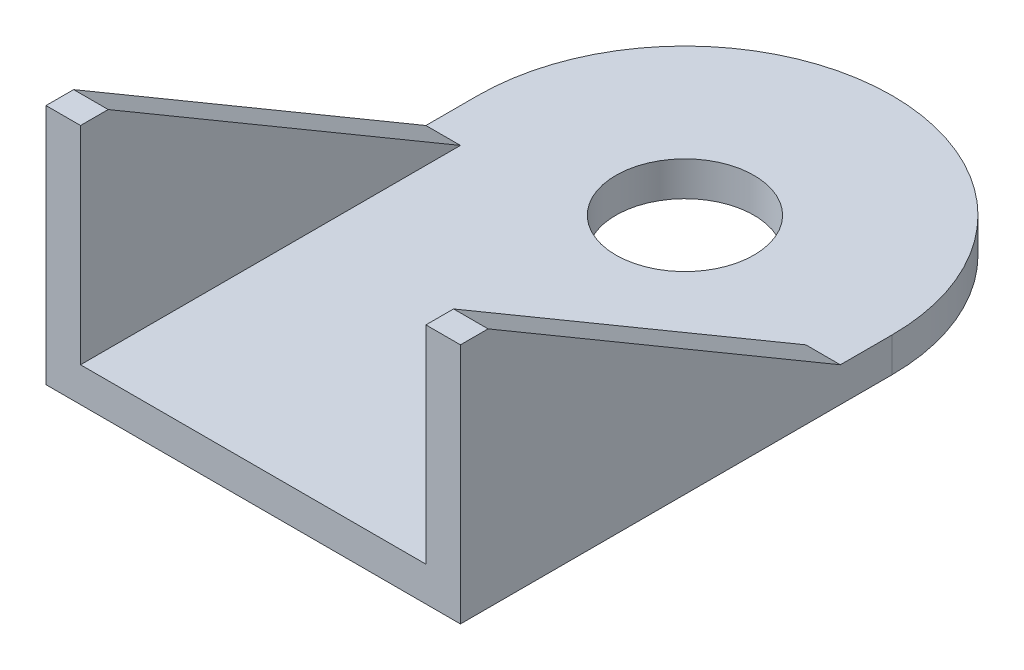
ISO-10303-21;
HEADER;
FILE_DESCRIPTION(('STEP AP214'),'2;1');
FILE_NAME('part.step','',(''),(''),'','','');
FILE_SCHEMA(('AUTOMOTIVE_DESIGN { 1 0 10303 214 1 1 1 1 }'));
ENDSEC;
DATA;
#1=APPLICATION_CONTEXT('core data for automotive mechanical design processes');
#2=APPLICATION_PROTOCOL_DEFINITION('international standard','automotive_design',2000,#1);
#3=PRODUCT_CONTEXT('',#1,'mechanical');
#4=PRODUCT('Part','Part','',(#3));
#5=PRODUCT_RELATED_PRODUCT_CATEGORY('part','',(#4));
#6=PRODUCT_DEFINITION_FORMATION('','',#4);
#7=PRODUCT_DEFINITION_CONTEXT('part definition',#1,'design');
#8=PRODUCT_DEFINITION('design','',#6,#7);
#9=PRODUCT_DEFINITION_SHAPE('','',#8);
#10=(LENGTH_UNIT() NAMED_UNIT(*) SI_UNIT(.MILLI.,.METRE.));
#11=(NAMED_UNIT(*) PLANE_ANGLE_UNIT() SI_UNIT($,.RADIAN.));
#12=(NAMED_UNIT(*) SI_UNIT($,.STERADIAN.) SOLID_ANGLE_UNIT());
#13=UNCERTAINTY_MEASURE_WITH_UNIT(LENGTH_MEASURE(1.E-05),#10,'distance_accuracy_value','');
#14=(GEOMETRIC_REPRESENTATION_CONTEXT(3) GLOBAL_UNCERTAINTY_ASSIGNED_CONTEXT((#13)) GLOBAL_UNIT_ASSIGNED_CONTEXT((#10,
#11,#12)) REPRESENTATION_CONTEXT('',''));
#15=CARTESIAN_POINT('',(0.,0.,0.));
#16=DIRECTION('',(0.,0.,1.));
#17=DIRECTION('',(1.,0.,0.));
#18=AXIS2_PLACEMENT_3D('',#15,#16,#17);
#19=CARTESIAN_POINT('',(0.,0.,0.));
#20=DIRECTION('',(0.,1.,0.));
#21=DIRECTION('',(0.,0.,1.));
#22=AXIS2_PLACEMENT_3D('',#19,#20,#21);
#23=PLANE('',#22);
#24=CARTESIAN_POINT('',(0.,0.,0.));
#25=DIRECTION('',(0.,1.,0.));
#26=DIRECTION('',(0.,0.,1.));
#27=AXIS2_PLACEMENT_3D('',#24,#25,#26);
#28=CIRCLE('',#27,12.);
#29=CARTESIAN_POINT('',(12.,0.,0.));
#30=VERTEX_POINT('',#29);
#31=CARTESIAN_POINT('',(-12.,0.,0.));
#32=VERTEX_POINT('',#31);
#33=EDGE_CURVE('E11',#30,#32,#28,.F.);
#34=ORIENTED_EDGE('',*,*,#33,.F.);
#35=DIRECTION('',(0.,0.,-1.));
#36=VECTOR('',#35,1.);
#37=CARTESIAN_POINT('',(12.,0.,0.));
#38=LINE('',#37,#36);
#39=CARTESIAN_POINT('',(12.,0.,25.));
#40=VERTEX_POINT('',#39);
#41=EDGE_CURVE('E173',#40,#30,#38,.T.);
#42=ORIENTED_EDGE('',*,*,#41,.F.);
#43=DIRECTION('',(1.,0.,0.));
#44=VECTOR('',#43,1.);
#45=CARTESIAN_POINT('',(0.,0.,25.));
#46=LINE('',#45,#44);
#47=CARTESIAN_POINT('',(-12.,0.,25.));
#48=VERTEX_POINT('',#47);
#49=EDGE_CURVE('E194',#48,#40,#46,.T.);
#50=ORIENTED_EDGE('',*,*,#49,.F.);
#51=DIRECTION('',(0.,0.,1.));
#52=VECTOR('',#51,1.);
#53=CARTESIAN_POINT('',(-12.,0.,0.));
#54=LINE('',#53,#52);
#55=EDGE_CURVE('E192',#32,#48,#54,.T.);
#56=ORIENTED_EDGE('',*,*,#55,.F.);
#57=EDGE_LOOP('',(#34,#42,#50,#56));
#58=FACE_BOUND('',#57,.T.);
#59=ADVANCED_FACE('F41',(#58),#23,.F.);
#60=CARTESIAN_POINT('',(0.,0.,0.));
#61=DIRECTION('',(0.,1.,0.));
#62=DIRECTION('',(0.,0.,1.));
#63=AXIS2_PLACEMENT_3D('',#60,#61,#62);
#64=CIRCLE('',#63,12.);
#65=EDGE_CURVE('E189',#30,#32,#64,.T.);
#66=ORIENTED_EDGE('',*,*,#65,.F.);
#67=ORIENTED_EDGE('',*,*,#33,.T.);
#68=EDGE_LOOP('',(#66,#67));
#69=FACE_BOUND('',#68,.T.);
#70=CARTESIAN_POINT('',(0.,0.,0.));
#71=DIRECTION('',(0.,1.,0.));
#72=DIRECTION('',(0.,0.,1.));
#73=AXIS2_PLACEMENT_3D('',#70,#71,#72);
#74=CIRCLE('',#73,9.);
#75=CARTESIAN_POINT('',(0.,0.,9.));
#76=VERTEX_POINT('',#75);
#77=EDGE_CURVE('E50',#76,#76,#74,.F.);
#78=ORIENTED_EDGE('',*,*,#77,.F.);
#79=EDGE_LOOP('',(#78));
#80=FACE_BOUND('',#79,.T.);
#81=ADVANCED_FACE('F217',(#69,#80),#23,.F.);
#82=CARTESIAN_POINT('',(0.,2.,0.));
#83=DIRECTION('',(0.,1.,0.));
#84=DIRECTION('',(0.,0.,1.));
#85=AXIS2_PLACEMENT_3D('',#82,#83,#84);
#86=PLANE('',#85);
#87=CARTESIAN_POINT('',(0.,2.,0.));
#88=DIRECTION('',(0.,1.,0.));
#89=DIRECTION('',(0.,0.,1.));
#90=AXIS2_PLACEMENT_3D('',#87,#88,#89);
#91=CIRCLE('',#90,4.);
#92=CARTESIAN_POINT('',(0.,2.,4.));
#93=VERTEX_POINT('',#92);
#94=EDGE_CURVE('E127',#93,#93,#91,.T.);
#95=ORIENTED_EDGE('',*,*,#94,.F.);
#96=EDGE_LOOP('',(#95));
#97=FACE_BOUND('',#96,.T.);
#98=DIRECTION('',(0.,0.,1.));
#99=VECTOR('',#98,1.);
#100=CARTESIAN_POINT('',(-12.,2.,0.));
#101=LINE('',#100,#99);
#102=CARTESIAN_POINT('',(-12.,2.,0.));
#103=VERTEX_POINT('',#102);
#104=CARTESIAN_POINT('',(-12.,2.,3.));
#105=VERTEX_POINT('',#104);
#106=EDGE_CURVE('E62',#103,#105,#101,.T.);
#107=ORIENTED_EDGE('',*,*,#106,.T.);
#108=DIRECTION('',(-1.,0.,0.));
#109=VECTOR('',#108,1.);
#110=CARTESIAN_POINT('',(-10.,2.,3.));
#111=LINE('',#110,#109);
#112=CARTESIAN_POINT('',(-10.,2.,3.));
#113=VERTEX_POINT('',#112);
#114=EDGE_CURVE('E57',#113,#105,#111,.T.);
#115=ORIENTED_EDGE('',*,*,#114,.F.);
#116=DIRECTION('',(0.,0.,-1.));
#117=VECTOR('',#116,1.);
#118=CARTESIAN_POINT('',(-10.,2.,3.));
#119=LINE('',#118,#117);
#120=CARTESIAN_POINT('',(-10.,2.,25.));
#121=VERTEX_POINT('',#120);
#122=EDGE_CURVE('E130',#121,#113,#119,.T.);
#123=ORIENTED_EDGE('',*,*,#122,.F.);
#124=DIRECTION('',(1.,0.,0.));
#125=VECTOR('',#124,1.);
#126=CARTESIAN_POINT('',(0.,2.,25.));
#127=LINE('',#126,#125);
#128=CARTESIAN_POINT('',(10.,2.,25.));
#129=VERTEX_POINT('',#128);
#130=EDGE_CURVE('E118',#121,#129,#127,.T.);
#131=ORIENTED_EDGE('',*,*,#130,.T.);
#132=DIRECTION('',(0.,0.,-1.));
#133=VECTOR('',#132,1.);
#134=CARTESIAN_POINT('',(10.,2.,3.));
#135=LINE('',#134,#133);
#136=CARTESIAN_POINT('',(10.,2.,3.));
#137=VERTEX_POINT('',#136);
#138=EDGE_CURVE('E155',#129,#137,#135,.T.);
#139=ORIENTED_EDGE('',*,*,#138,.T.);
#140=DIRECTION('',(1.,0.,0.));
#141=VECTOR('',#140,1.);
#142=CARTESIAN_POINT('',(10.,2.,3.));
#143=LINE('',#142,#141);
#144=CARTESIAN_POINT('',(12.,2.,3.));
#145=VERTEX_POINT('',#144);
#146=EDGE_CURVE('E165',#137,#145,#143,.T.);
#147=ORIENTED_EDGE('',*,*,#146,.T.);
#148=DIRECTION('',(0.,0.,-1.));
#149=VECTOR('',#148,1.);
#150=CARTESIAN_POINT('',(12.,2.,0.));
#151=LINE('',#150,#149);
#152=CARTESIAN_POINT('',(12.,2.,0.));
#153=VERTEX_POINT('',#152);
#154=EDGE_CURVE('E178',#145,#153,#151,.T.);
#155=ORIENTED_EDGE('',*,*,#154,.T.);
#156=CARTESIAN_POINT('',(0.,2.,0.));
#157=DIRECTION('',(0.,1.,0.));
#158=DIRECTION('',(0.,0.,1.));
#159=AXIS2_PLACEMENT_3D('',#156,#157,#158);
#160=CIRCLE('',#159,12.);
#161=EDGE_CURVE('E180',#153,#103,#160,.T.);
#162=ORIENTED_EDGE('',*,*,#161,.T.);
#163=EDGE_LOOP('',(#107,#115,#123,#131,#139,#147,#155,#162));
#164=FACE_BOUND('',#163,.T.);
#165=ADVANCED_FACE('F131',(#97,#164),#86,.T.);
#166=CARTESIAN_POINT('',(12.,2.,0.));
#167=DIRECTION('',(-1.,0.,0.));
#168=DIRECTION('',(0.,0.,1.));
#169=AXIS2_PLACEMENT_3D('',#166,#167,#168);
#170=PLANE('',#169);
#171=ORIENTED_EDGE('',*,*,#41,.T.);
#172=DIRECTION('',(0.,-1.,0.));
#173=VECTOR('',#172,1.);
#174=CARTESIAN_POINT('',(12.,2.,0.));
#175=LINE('',#174,#173);
#176=EDGE_CURVE('E206',#153,#30,#175,.T.);
#177=ORIENTED_EDGE('',*,*,#176,.F.);
#178=ORIENTED_EDGE('',*,*,#154,.F.);
#179=DIRECTION('',(0.,0.507020126563394,0.861934215157769));
#180=VECTOR('',#179,1.);
#181=CARTESIAN_POINT('',(12.,14.,23.4));
#182=LINE('',#181,#180);
#183=CARTESIAN_POINT('',(12.,14.,23.4));
#184=VERTEX_POINT('',#183);
#185=EDGE_CURVE('E150',#145,#184,#182,.T.);
#186=ORIENTED_EDGE('',*,*,#185,.T.);
#187=DIRECTION('',(0.,0.,1.));
#188=VECTOR('',#187,1.);
#189=CARTESIAN_POINT('',(12.,14.,25.));
#190=LINE('',#189,#188);
#191=CARTESIAN_POINT('',(12.,14.,25.));
#192=VERTEX_POINT('',#191);
#193=EDGE_CURVE('E158',#184,#192,#190,.T.);
#194=ORIENTED_EDGE('',*,*,#193,.T.);
#195=DIRECTION('',(0.,-1.,0.));
#196=VECTOR('',#195,1.);
#197=CARTESIAN_POINT('',(12.,2.,25.));
#198=LINE('',#197,#196);
#199=EDGE_CURVE('E186',#192,#40,#198,.T.);
#200=ORIENTED_EDGE('',*,*,#199,.T.);
#201=EDGE_LOOP('',(#171,#177,#178,#186,#194,#200));
#202=FACE_BOUND('',#201,.T.);
#203=ADVANCED_FACE('F43',(#202),#170,.F.);
#204=CARTESIAN_POINT('',(0.,2.,0.));
#205=DIRECTION('',(0.,-1.,0.));
#206=DIRECTION('',(0.,0.,-1.));
#207=AXIS2_PLACEMENT_3D('',#204,#205,#206);
#208=CYLINDRICAL_SURFACE('',#207,12.);
#209=ORIENTED_EDGE('',*,*,#65,.T.);
#210=DIRECTION('',(0.,-1.,0.));
#211=VECTOR('',#210,1.);
#212=CARTESIAN_POINT('',(-12.,2.,0.));
#213=LINE('',#212,#211);
#214=EDGE_CURVE('E203',#103,#32,#213,.T.);
#215=ORIENTED_EDGE('',*,*,#214,.F.);
#216=ORIENTED_EDGE('',*,*,#161,.F.);
#217=ORIENTED_EDGE('',*,*,#176,.T.);
#218=EDGE_LOOP('',(#209,#215,#216,#217));
#219=FACE_BOUND('',#218,.T.);
#220=ADVANCED_FACE('F249',(#219),#208,.T.);
#221=CARTESIAN_POINT('',(-12.,2.,0.));
#222=DIRECTION('',(1.,0.,0.));
#223=DIRECTION('',(0.,0.,-1.));
#224=AXIS2_PLACEMENT_3D('',#221,#222,#223);
#225=PLANE('',#224);
#226=ORIENTED_EDGE('',*,*,#55,.T.);
#227=DIRECTION('',(0.,-1.,0.));
#228=VECTOR('',#227,1.);
#229=CARTESIAN_POINT('',(-12.,2.,25.));
#230=LINE('',#229,#228);
#231=CARTESIAN_POINT('',(-12.,14.,25.));
#232=VERTEX_POINT('',#231);
#233=EDGE_CURVE('E200',#232,#48,#230,.T.);
#234=ORIENTED_EDGE('',*,*,#233,.F.);
#235=DIRECTION('',(0.,0.,1.));
#236=VECTOR('',#235,1.);
#237=CARTESIAN_POINT('',(-12.,14.,25.));
#238=LINE('',#237,#236);
#239=CARTESIAN_POINT('',(-12.,14.,23.4));
#240=VERTEX_POINT('',#239);
#241=EDGE_CURVE('E145',#240,#232,#238,.T.);
#242=ORIENTED_EDGE('',*,*,#241,.F.);
#243=DIRECTION('',(0.,0.507020126563394,0.861934215157769));
#244=VECTOR('',#243,1.);
#245=CARTESIAN_POINT('',(-12.,14.,23.4));
#246=LINE('',#245,#244);
#247=EDGE_CURVE('E133',#105,#240,#246,.T.);
#248=ORIENTED_EDGE('',*,*,#247,.F.);
#249=ORIENTED_EDGE('',*,*,#106,.F.);
#250=ORIENTED_EDGE('',*,*,#214,.T.);
#251=EDGE_LOOP('',(#226,#234,#242,#248,#249,#250));
#252=FACE_BOUND('',#251,.T.);
#253=ADVANCED_FACE('F244',(#252),#225,.F.);
#254=CARTESIAN_POINT('',(0.,2.,25.));
#255=DIRECTION('',(0.,0.,-1.));
#256=DIRECTION('',(-1.,0.,0.));
#257=AXIS2_PLACEMENT_3D('',#254,#255,#256);
#258=PLANE('',#257);
#259=ORIENTED_EDGE('',*,*,#49,.T.);
#260=ORIENTED_EDGE('',*,*,#199,.F.);
#261=DIRECTION('',(1.,0.,0.));
#262=VECTOR('',#261,1.);
#263=CARTESIAN_POINT('',(10.,14.,25.));
#264=LINE('',#263,#262);
#265=CARTESIAN_POINT('',(10.,14.,25.));
#266=VERTEX_POINT('',#265);
#267=EDGE_CURVE('E170',#266,#192,#264,.T.);
#268=ORIENTED_EDGE('',*,*,#267,.F.);
#269=DIRECTION('',(0.,-1.,0.));
#270=VECTOR('',#269,1.);
#271=CARTESIAN_POINT('',(10.,2.,25.));
#272=LINE('',#271,#270);
#273=EDGE_CURVE('E124',#266,#129,#272,.T.);
#274=ORIENTED_EDGE('',*,*,#273,.T.);
#275=ORIENTED_EDGE('',*,*,#130,.F.);
#276=DIRECTION('',(0.,-1.,0.));
#277=VECTOR('',#276,1.);
#278=CARTESIAN_POINT('',(-10.,2.,25.));
#279=LINE('',#278,#277);
#280=CARTESIAN_POINT('',(-10.,14.,25.));
#281=VERTEX_POINT('',#280);
#282=EDGE_CURVE('E122',#281,#121,#279,.T.);
#283=ORIENTED_EDGE('',*,*,#282,.F.);
#284=DIRECTION('',(-1.,0.,0.));
#285=VECTOR('',#284,1.);
#286=CARTESIAN_POINT('',(-10.,14.,25.));
#287=LINE('',#286,#285);
#288=EDGE_CURVE('E144',#281,#232,#287,.T.);
#289=ORIENTED_EDGE('',*,*,#288,.T.);
#290=ORIENTED_EDGE('',*,*,#233,.T.);
#291=EDGE_LOOP('',(#259,#260,#268,#274,#275,#283,#289,#290));
#292=FACE_BOUND('',#291,.T.);
#293=ADVANCED_FACE('F119',(#292),#258,.F.);
#294=CARTESIAN_POINT('',(0.,2.,0.));
#295=DIRECTION('',(0.,-1.,0.));
#296=DIRECTION('',(0.,0.,-1.));
#297=AXIS2_PLACEMENT_3D('',#294,#295,#296);
#298=CYLINDRICAL_SURFACE('',#297,4.);
#299=ORIENTED_EDGE('',*,*,#94,.T.);
#300=EDGE_LOOP('',(#299));
#301=FACE_BOUND('',#300,.T.);
#302=CARTESIAN_POINT('',(0.,0.,0.));
#303=DIRECTION('',(0.,1.,0.));
#304=DIRECTION('',(0.,0.,1.));
#305=AXIS2_PLACEMENT_3D('',#302,#303,#304);
#306=CIRCLE('',#305,4.);
#307=CARTESIAN_POINT('',(0.,0.,4.));
#308=VERTEX_POINT('',#307);
#309=EDGE_CURVE('E181',#308,#308,#306,.T.);
#310=ORIENTED_EDGE('',*,*,#309,.F.);
#311=EDGE_LOOP('',(#310));
#312=FACE_BOUND('',#311,.T.);
#313=ADVANCED_FACE('F232',(#301,#312),#298,.F.);
#314=ORIENTED_EDGE('',*,*,#77,.T.);
#315=EDGE_LOOP('',(#314));
#316=FACE_BOUND('',#315,.T.);
#317=ORIENTED_EDGE('',*,*,#309,.T.);
#318=EDGE_LOOP('',(#317));
#319=FACE_BOUND('',#318,.T.);
#320=ADVANCED_FACE('F214',(#316,#319),#23,.F.);
#321=CARTESIAN_POINT('',(10.,14.,25.));
#322=DIRECTION('',(0.,1.,0.));
#323=DIRECTION('',(0.,0.,1.));
#324=AXIS2_PLACEMENT_3D('',#321,#322,#323);
#325=PLANE('',#324);
#326=ORIENTED_EDGE('',*,*,#193,.F.);
#327=DIRECTION('',(1.,0.,0.));
#328=VECTOR('',#327,1.);
#329=CARTESIAN_POINT('',(10.,14.,23.4));
#330=LINE('',#329,#328);
#331=CARTESIAN_POINT('',(10.,14.,23.4));
#332=VERTEX_POINT('',#331);
#333=EDGE_CURVE('E174',#332,#184,#330,.T.);
#334=ORIENTED_EDGE('',*,*,#333,.F.);
#335=DIRECTION('',(0.,0.,1.));
#336=VECTOR('',#335,1.);
#337=CARTESIAN_POINT('',(10.,14.,25.));
#338=LINE('',#337,#336);
#339=EDGE_CURVE('E161',#332,#266,#338,.T.);
#340=ORIENTED_EDGE('',*,*,#339,.T.);
#341=ORIENTED_EDGE('',*,*,#267,.T.);
#342=EDGE_LOOP('',(#326,#334,#340,#341));
#343=FACE_BOUND('',#342,.T.);
#344=ADVANCED_FACE('F231',(#343),#325,.T.);
#345=CARTESIAN_POINT('',(10.,14.,23.4));
#346=DIRECTION('',(0.,0.861934215157769,-0.507020126563394));
#347=DIRECTION('',(0.,0.507020126563394,0.861934215157769));
#348=AXIS2_PLACEMENT_3D('',#345,#346,#347);
#349=PLANE('',#348);
#350=ORIENTED_EDGE('',*,*,#185,.F.);
#351=ORIENTED_EDGE('',*,*,#146,.F.);
#352=DIRECTION('',(0.,0.507020126563394,0.861934215157769));
#353=VECTOR('',#352,1.);
#354=CARTESIAN_POINT('',(10.,14.,23.4));
#355=LINE('',#354,#353);
#356=EDGE_CURVE('E157',#137,#332,#355,.T.);
#357=ORIENTED_EDGE('',*,*,#356,.T.);
#358=ORIENTED_EDGE('',*,*,#333,.T.);
#359=EDGE_LOOP('',(#350,#351,#357,#358));
#360=FACE_BOUND('',#359,.T.);
#361=ADVANCED_FACE('F237',(#360),#349,.T.);
#362=CARTESIAN_POINT('',(10.,0.,0.));
#363=DIRECTION('',(-1.,0.,0.));
#364=DIRECTION('',(0.,0.,1.));
#365=AXIS2_PLACEMENT_3D('',#362,#363,#364);
#366=PLANE('',#365);
#367=ORIENTED_EDGE('',*,*,#138,.F.);
#368=ORIENTED_EDGE('',*,*,#273,.F.);
#369=ORIENTED_EDGE('',*,*,#339,.F.);
#370=ORIENTED_EDGE('',*,*,#356,.F.);
#371=EDGE_LOOP('',(#367,#368,#369,#370));
#372=FACE_BOUND('',#371,.T.);
#373=ADVANCED_FACE('F268',(#372),#366,.T.);
#374=CARTESIAN_POINT('',(-10.,14.,23.4));
#375=DIRECTION('',(0.,-0.861934215157769,0.507020126563394));
#376=DIRECTION('',(0.,-0.507020126563394,-0.861934215157769));
#377=AXIS2_PLACEMENT_3D('',#374,#375,#376);
#378=PLANE('',#377);
#379=ORIENTED_EDGE('',*,*,#247,.T.);
#380=DIRECTION('',(-1.,0.,0.));
#381=VECTOR('',#380,1.);
#382=CARTESIAN_POINT('',(-10.,14.,23.4));
#383=LINE('',#382,#381);
#384=CARTESIAN_POINT('',(-10.,14.,23.4));
#385=VERTEX_POINT('',#384);
#386=EDGE_CURVE('E151',#385,#240,#383,.T.);
#387=ORIENTED_EDGE('',*,*,#386,.F.);
#388=DIRECTION('',(0.,0.507020126563394,0.861934215157769));
#389=VECTOR('',#388,1.);
#390=CARTESIAN_POINT('',(-10.,14.,23.4));
#391=LINE('',#390,#389);
#392=EDGE_CURVE('E140',#113,#385,#391,.T.);
#393=ORIENTED_EDGE('',*,*,#392,.F.);
#394=ORIENTED_EDGE('',*,*,#114,.T.);
#395=EDGE_LOOP('',(#379,#387,#393,#394));
#396=FACE_BOUND('',#395,.T.);
#397=ADVANCED_FACE('F275',(#396),#378,.F.);
#398=CARTESIAN_POINT('',(-10.,14.,25.));
#399=DIRECTION('',(0.,-1.,0.));
#400=DIRECTION('',(0.,0.,-1.));
#401=AXIS2_PLACEMENT_3D('',#398,#399,#400);
#402=PLANE('',#401);
#403=ORIENTED_EDGE('',*,*,#241,.T.);
#404=ORIENTED_EDGE('',*,*,#288,.F.);
#405=DIRECTION('',(0.,0.,1.));
#406=VECTOR('',#405,1.);
#407=CARTESIAN_POINT('',(-10.,14.,25.));
#408=LINE('',#407,#406);
#409=EDGE_CURVE('E137',#385,#281,#408,.T.);
#410=ORIENTED_EDGE('',*,*,#409,.F.);
#411=ORIENTED_EDGE('',*,*,#386,.T.);
#412=EDGE_LOOP('',(#403,#404,#410,#411));
#413=FACE_BOUND('',#412,.T.);
#414=ADVANCED_FACE('F278',(#413),#402,.F.);
#415=CARTESIAN_POINT('',(-10.,0.,0.));
#416=DIRECTION('',(1.,0.,0.));
#417=DIRECTION('',(0.,0.,1.));
#418=AXIS2_PLACEMENT_3D('',#415,#416,#417);
#419=PLANE('',#418);
#420=ORIENTED_EDGE('',*,*,#122,.T.);
#421=ORIENTED_EDGE('',*,*,#392,.T.);
#422=ORIENTED_EDGE('',*,*,#409,.T.);
#423=ORIENTED_EDGE('',*,*,#282,.T.);
#424=EDGE_LOOP('',(#420,#421,#422,#423));
#425=FACE_BOUND('',#424,.T.);
#426=ADVANCED_FACE('F135',(#425),#419,.T.);
#427=CLOSED_SHELL('',(#59,#81,#165,#203,#220,#253,#293,#313,#320,#344,#361,#373,#397,#414,#426));
#428=MANIFOLD_SOLID_BREP('B2',#427);
#429=ADVANCED_BREP_SHAPE_REPRESENTATION('',(#18,#428),#14);
#430=SHAPE_DEFINITION_REPRESENTATION(#9,#429);
ENDSEC;
END-ISO-10303-21;
